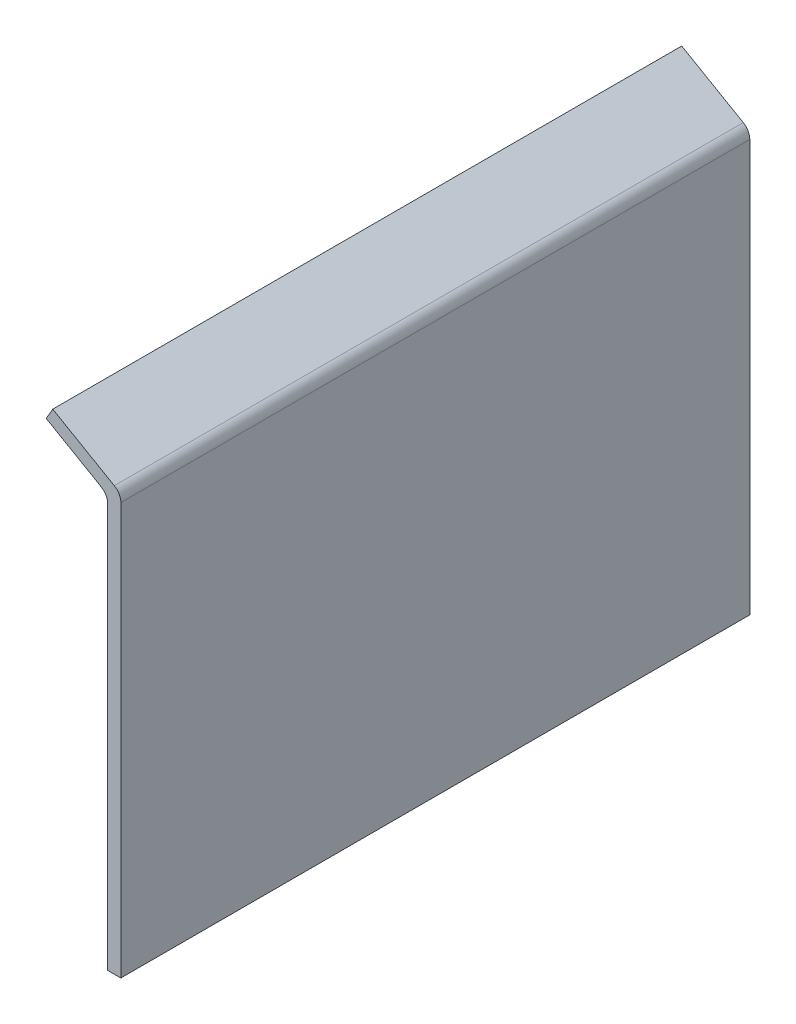
ISO-10303-21;
HEADER;
FILE_DESCRIPTION(('STEP AP214'),'2;1');
FILE_NAME('part.step','',(''),(''),'','','');
FILE_SCHEMA(('AUTOMOTIVE_DESIGN { 1 0 10303 214 1 1 1 1 }'));
ENDSEC;
DATA;
#1=APPLICATION_CONTEXT('core data for automotive mechanical design processes');
#2=APPLICATION_PROTOCOL_DEFINITION('international standard','automotive_design',2000,#1);
#3=PRODUCT_CONTEXT('',#1,'mechanical');
#4=PRODUCT('Part','Part','',(#3));
#5=PRODUCT_RELATED_PRODUCT_CATEGORY('part','',(#4));
#6=PRODUCT_DEFINITION_FORMATION('','',#4);
#7=PRODUCT_DEFINITION_CONTEXT('part definition',#1,'design');
#8=PRODUCT_DEFINITION('design','',#6,#7);
#9=PRODUCT_DEFINITION_SHAPE('','',#8);
#10=(LENGTH_UNIT() NAMED_UNIT(*) SI_UNIT(.MILLI.,.METRE.));
#11=(NAMED_UNIT(*) PLANE_ANGLE_UNIT() SI_UNIT($,.RADIAN.));
#12=(NAMED_UNIT(*) SI_UNIT($,.STERADIAN.) SOLID_ANGLE_UNIT());
#13=UNCERTAINTY_MEASURE_WITH_UNIT(LENGTH_MEASURE(1.E-05),#10,'distance_accuracy_value','');
#14=(GEOMETRIC_REPRESENTATION_CONTEXT(3) GLOBAL_UNCERTAINTY_ASSIGNED_CONTEXT((#13)) GLOBAL_UNIT_ASSIGNED_CONTEXT((#10,
#11,#12)) REPRESENTATION_CONTEXT('',''));
#15=CARTESIAN_POINT('',(0.,0.,0.));
#16=DIRECTION('',(0.,0.,1.));
#17=DIRECTION('',(1.,0.,0.));
#18=AXIS2_PLACEMENT_3D('',#15,#16,#17);
#19=CARTESIAN_POINT('',(6.34999999999998,199.533825790646,0.));
#20=DIRECTION('',(1.,0.,0.));
#21=DIRECTION('',(0.,0.,-1.));
#22=AXIS2_PLACEMENT_3D('',#19,#20,#21);
#23=PLANE('',#22);
#24=DIRECTION('',(0.,1.,0.));
#25=VECTOR('',#24,1.);
#26=CARTESIAN_POINT('',(6.35,0.,0.));
#27=LINE('',#26,#25);
#28=CARTESIAN_POINT('',(6.35,0.,0.));
#29=VERTEX_POINT('',#28);
#30=CARTESIAN_POINT('',(6.34999999999998,199.533825790646,0.));
#31=VERTEX_POINT('',#30);
#32=EDGE_CURVE('E34',#29,#31,#27,.T.);
#33=ORIENTED_EDGE('',*,*,#32,.F.);
#34=DIRECTION('',(0.,0.,-1.));
#35=VECTOR('',#34,1.);
#36=CARTESIAN_POINT('',(6.35,0.,0.));
#37=LINE('',#36,#35);
#38=CARTESIAN_POINT('',(6.35,0.,-304.8));
#39=VERTEX_POINT('',#38);
#40=EDGE_CURVE('E10',#29,#39,#37,.T.);
#41=ORIENTED_EDGE('',*,*,#40,.T.);
#42=DIRECTION('',(0.,-1.,0.));
#43=VECTOR('',#42,1.);
#44=CARTESIAN_POINT('',(6.34999999999998,199.533825790646,-304.8));
#45=LINE('',#44,#43);
#46=CARTESIAN_POINT('',(6.34999999999998,199.533825790646,-304.8));
#47=VERTEX_POINT('',#46);
#48=EDGE_CURVE('E103',#47,#39,#45,.T.);
#49=ORIENTED_EDGE('',*,*,#48,.F.);
#50=DIRECTION('',(0.,0.,-1.));
#51=VECTOR('',#50,1.);
#52=CARTESIAN_POINT('',(6.34999999999998,199.533825790646,0.));
#53=LINE('',#52,#51);
#54=EDGE_CURVE('E26',#31,#47,#53,.T.);
#55=ORIENTED_EDGE('',*,*,#54,.F.);
#56=EDGE_LOOP('',(#33,#41,#49,#55));
#57=FACE_BOUND('',#56,.T.);
#58=ADVANCED_FACE('F16',(#57),#23,.T.);
#59=CARTESIAN_POINT('',(0.,199.533825790646,0.));
#60=DIRECTION('',(0.,0.,-1.));
#61=DIRECTION('',(0.,-1.,0.));
#62=AXIS2_PLACEMENT_3D('',#59,#60,#61);
#63=CYLINDRICAL_SURFACE('',#62,6.35000000000003);
#64=CARTESIAN_POINT('',(0.,199.533825790646,0.));
#65=DIRECTION('',(0.,0.,1.));
#66=DIRECTION('',(1.,0.,0.));
#67=AXIS2_PLACEMENT_3D('',#64,#65,#66);
#68=CIRCLE('',#67,6.35000000000003);
#69=CARTESIAN_POINT('',(3.17499999999997,205.033087104677,0.));
#70=VERTEX_POINT('',#69);
#71=EDGE_CURVE('E109',#31,#70,#68,.T.);
#72=ORIENTED_EDGE('',*,*,#71,.F.);
#73=ORIENTED_EDGE('',*,*,#54,.T.);
#74=CARTESIAN_POINT('',(0.,199.533825790646,-304.8));
#75=DIRECTION('',(0.,0.,-1.));
#76=DIRECTION('',(0.,-1.,0.));
#77=AXIS2_PLACEMENT_3D('',#74,#75,#76);
#78=CIRCLE('',#77,6.35000000000003);
#79=CARTESIAN_POINT('',(3.17499999999997,205.033087104677,-304.8));
#80=VERTEX_POINT('',#79);
#81=EDGE_CURVE('E105',#80,#47,#78,.T.);
#82=ORIENTED_EDGE('',*,*,#81,.F.);
#83=DIRECTION('',(0.,0.,-1.));
#84=VECTOR('',#83,1.);
#85=CARTESIAN_POINT('',(3.17499999999997,205.033087104677,0.));
#86=LINE('',#85,#84);
#87=EDGE_CURVE('E138',#70,#80,#86,.T.);
#88=ORIENTED_EDGE('',*,*,#87,.F.);
#89=EDGE_LOOP('',(#72,#73,#82,#88));
#90=FACE_BOUND('',#89,.T.);
#91=ADVANCED_FACE('F147',(#90),#63,.T.);
#92=CARTESIAN_POINT('',(-26.6455678841872,222.25,0.));
#93=DIRECTION('',(0.499999999999998,0.86602540378444,0.));
#94=DIRECTION('',(-0.86602540378444,0.499999999999998,0.));
#95=AXIS2_PLACEMENT_3D('',#92,#93,#94);
#96=PLANE('',#95);
#97=DIRECTION('',(-0.866025403784439,0.499999999999999,0.));
#98=VECTOR('',#97,1.);
#99=CARTESIAN_POINT('',(3.17499999999994,205.033087104677,0.));
#100=LINE('',#99,#98);
#101=CARTESIAN_POINT('',(-26.6455678841872,222.25,0.));
#102=VERTEX_POINT('',#101);
#103=EDGE_CURVE('E135',#70,#102,#100,.T.);
#104=ORIENTED_EDGE('',*,*,#103,.F.);
#105=ORIENTED_EDGE('',*,*,#87,.T.);
#106=DIRECTION('',(0.866025403784439,-0.5,0.));
#107=VECTOR('',#106,1.);
#108=CARTESIAN_POINT('',(-26.6455678841872,222.25,-304.8));
#109=LINE('',#108,#107);
#110=CARTESIAN_POINT('',(-26.6455678841872,222.25,-304.8));
#111=VERTEX_POINT('',#110);
#112=EDGE_CURVE('E133',#111,#80,#109,.T.);
#113=ORIENTED_EDGE('',*,*,#112,.F.);
#114=DIRECTION('',(0.,0.,-1.));
#115=VECTOR('',#114,1.);
#116=CARTESIAN_POINT('',(-26.6455678841872,222.25,0.));
#117=LINE('',#116,#115);
#118=EDGE_CURVE('E130',#102,#111,#117,.T.);
#119=ORIENTED_EDGE('',*,*,#118,.F.);
#120=EDGE_LOOP('',(#104,#105,#113,#119));
#121=FACE_BOUND('',#120,.T.);
#122=ADVANCED_FACE('F154',(#121),#96,.T.);
#123=CARTESIAN_POINT('',(-29.8205678841872,216.750738685969,0.));
#124=DIRECTION('',(-0.866025403784438,0.500000000000001,0.));
#125=DIRECTION('',(-0.500000000000001,-0.866025403784438,0.));
#126=AXIS2_PLACEMENT_3D('',#123,#124,#125);
#127=PLANE('',#126);
#128=DIRECTION('',(-0.500000000000001,-0.866025403784438,0.));
#129=VECTOR('',#128,1.);
#130=CARTESIAN_POINT('',(-26.6455678841872,222.25,0.));
#131=LINE('',#130,#129);
#132=CARTESIAN_POINT('',(-29.8205678841872,216.750738685969,0.));
#133=VERTEX_POINT('',#132);
#134=EDGE_CURVE('E127',#102,#133,#131,.T.);
#135=ORIENTED_EDGE('',*,*,#134,.F.);
#136=ORIENTED_EDGE('',*,*,#118,.T.);
#137=DIRECTION('',(0.500000000000002,0.866025403784438,0.));
#138=VECTOR('',#137,1.);
#139=CARTESIAN_POINT('',(-29.8205678841872,216.750738685969,-304.8));
#140=LINE('',#139,#138);
#141=CARTESIAN_POINT('',(-29.8205678841872,216.750738685969,-304.8));
#142=VERTEX_POINT('',#141);
#143=EDGE_CURVE('E125',#142,#111,#140,.T.);
#144=ORIENTED_EDGE('',*,*,#143,.F.);
#145=DIRECTION('',(0.,0.,-1.));
#146=VECTOR('',#145,1.);
#147=CARTESIAN_POINT('',(-29.8205678841872,216.750738685969,0.));
#148=LINE('',#147,#146);
#149=EDGE_CURVE('E122',#133,#142,#148,.T.);
#150=ORIENTED_EDGE('',*,*,#149,.F.);
#151=EDGE_LOOP('',(#135,#136,#144,#150));
#152=FACE_BOUND('',#151,.T.);
#153=ADVANCED_FACE('F156',(#152),#127,.T.);
#154=CARTESIAN_POINT('',(-3.1750000000001,201.366912895323,0.));
#155=DIRECTION('',(-0.5,-0.866025403784438,0.));
#156=DIRECTION('',(0.866025403784438,-0.5,0.));
#157=AXIS2_PLACEMENT_3D('',#154,#155,#156);
#158=PLANE('',#157);
#159=DIRECTION('',(0.866025403784438,-0.500000000000002,0.));
#160=VECTOR('',#159,1.);
#161=CARTESIAN_POINT('',(-29.8205678841872,216.750738685969,0.));
#162=LINE('',#161,#160);
#163=CARTESIAN_POINT('',(-3.1750000000001,201.366912895323,0.));
#164=VERTEX_POINT('',#163);
#165=EDGE_CURVE('E119',#133,#164,#162,.T.);
#166=ORIENTED_EDGE('',*,*,#165,.F.);
#167=ORIENTED_EDGE('',*,*,#149,.T.);
#168=DIRECTION('',(-0.866025403784438,0.500000000000001,0.));
#169=VECTOR('',#168,1.);
#170=CARTESIAN_POINT('',(-3.1750000000001,201.366912895323,-304.8));
#171=LINE('',#170,#169);
#172=CARTESIAN_POINT('',(-3.1750000000001,201.366912895323,-304.8));
#173=VERTEX_POINT('',#172);
#174=EDGE_CURVE('E117',#173,#142,#171,.T.);
#175=ORIENTED_EDGE('',*,*,#174,.F.);
#176=DIRECTION('',(0.,0.,-1.));
#177=VECTOR('',#176,1.);
#178=CARTESIAN_POINT('',(-3.1750000000001,201.366912895323,0.));
#179=LINE('',#178,#177);
#180=EDGE_CURVE('E115',#164,#173,#179,.T.);
#181=ORIENTED_EDGE('',*,*,#180,.F.);
#182=EDGE_LOOP('',(#166,#167,#175,#181));
#183=FACE_BOUND('',#182,.T.);
#184=ADVANCED_FACE('F160',(#183),#158,.T.);
#185=CARTESIAN_POINT('',(-6.35000000000005,195.867651581292,0.));
#186=DIRECTION('',(0.,0.,-1.));
#187=DIRECTION('',(0.,-1.,0.));
#188=AXIS2_PLACEMENT_3D('',#185,#186,#187);
#189=CYLINDRICAL_SURFACE('',#188,6.35000000000003);
#190=CARTESIAN_POINT('',(-6.35000000000005,195.867651581292,0.));
#191=DIRECTION('',(0.,0.,-1.));
#192=DIRECTION('',(0.,-1.,0.));
#193=AXIS2_PLACEMENT_3D('',#190,#191,#192);
#194=CIRCLE('',#193,6.35000000000003);
#195=CARTESIAN_POINT('',(0.,195.867651581292,0.));
#196=VERTEX_POINT('',#195);
#197=EDGE_CURVE('E113',#164,#196,#194,.T.);
#198=ORIENTED_EDGE('',*,*,#197,.F.);
#199=ORIENTED_EDGE('',*,*,#180,.T.);
#200=CARTESIAN_POINT('',(-6.35000000000005,195.867651581292,-304.8));
#201=DIRECTION('',(0.,0.,1.));
#202=DIRECTION('',(1.,0.,0.));
#203=AXIS2_PLACEMENT_3D('',#200,#201,#202);
#204=CIRCLE('',#203,6.35000000000003);
#205=CARTESIAN_POINT('',(0.,195.867651581292,-304.8));
#206=VERTEX_POINT('',#205);
#207=EDGE_CURVE('E94',#206,#173,#204,.T.);
#208=ORIENTED_EDGE('',*,*,#207,.F.);
#209=DIRECTION('',(0.,0.,-1.));
#210=VECTOR('',#209,1.);
#211=CARTESIAN_POINT('',(0.,195.867651581292,0.));
#212=LINE('',#211,#210);
#213=EDGE_CURVE('E90',#196,#206,#212,.T.);
#214=ORIENTED_EDGE('',*,*,#213,.F.);
#215=EDGE_LOOP('',(#198,#199,#208,#214));
#216=FACE_BOUND('',#215,.T.);
#217=ADVANCED_FACE('F18',(#216),#189,.F.);
#218=CARTESIAN_POINT('',(0.,0.,0.));
#219=DIRECTION('',(-1.,0.,0.));
#220=DIRECTION('',(0.,0.,1.));
#221=AXIS2_PLACEMENT_3D('',#218,#219,#220);
#222=PLANE('',#221);
#223=DIRECTION('',(0.,-1.,0.));
#224=VECTOR('',#223,1.);
#225=CARTESIAN_POINT('',(0.,195.867651581292,0.));
#226=LINE('',#225,#224);
#227=CARTESIAN_POINT('',(0.,0.,0.));
#228=VERTEX_POINT('',#227);
#229=EDGE_CURVE('E78',#196,#228,#226,.T.);
#230=ORIENTED_EDGE('',*,*,#229,.F.);
#231=ORIENTED_EDGE('',*,*,#213,.T.);
#232=DIRECTION('',(0.,1.,0.));
#233=VECTOR('',#232,1.);
#234=CARTESIAN_POINT('',(0.,0.,-304.8));
#235=LINE('',#234,#233);
#236=CARTESIAN_POINT('',(0.,0.,-304.8));
#237=VERTEX_POINT('',#236);
#238=EDGE_CURVE('E84',#237,#206,#235,.T.);
#239=ORIENTED_EDGE('',*,*,#238,.F.);
#240=DIRECTION('',(0.,0.,-1.));
#241=VECTOR('',#240,1.);
#242=CARTESIAN_POINT('',(0.,0.,0.));
#243=LINE('',#242,#241);
#244=EDGE_CURVE('E87',#228,#237,#243,.T.);
#245=ORIENTED_EDGE('',*,*,#244,.F.);
#246=EDGE_LOOP('',(#230,#231,#239,#245));
#247=FACE_BOUND('',#246,.T.);
#248=ADVANCED_FACE('F86',(#247),#222,.T.);
#249=CARTESIAN_POINT('',(6.35,0.,0.));
#250=DIRECTION('',(0.,-1.,0.));
#251=DIRECTION('',(0.,0.,-1.));
#252=AXIS2_PLACEMENT_3D('',#249,#250,#251);
#253=PLANE('',#252);
#254=DIRECTION('',(1.,0.,0.));
#255=VECTOR('',#254,1.);
#256=CARTESIAN_POINT('',(0.,0.,0.));
#257=LINE('',#256,#255);
#258=EDGE_CURVE('E99',#228,#29,#257,.T.);
#259=ORIENTED_EDGE('',*,*,#258,.F.);
#260=ORIENTED_EDGE('',*,*,#244,.T.);
#261=DIRECTION('',(-1.,0.,0.));
#262=VECTOR('',#261,1.);
#263=CARTESIAN_POINT('',(6.35,0.,-304.8));
#264=LINE('',#263,#262);
#265=EDGE_CURVE('E20',#39,#237,#264,.T.);
#266=ORIENTED_EDGE('',*,*,#265,.F.);
#267=ORIENTED_EDGE('',*,*,#40,.F.);
#268=EDGE_LOOP('',(#259,#260,#266,#267));
#269=FACE_BOUND('',#268,.T.);
#270=ADVANCED_FACE('F98',(#269),#253,.T.);
#271=CARTESIAN_POINT('',(0.448900514581326,116.44186250355,-304.8));
#272=DIRECTION('',(0.,0.,1.));
#273=DIRECTION('',(1.,0.,0.));
#274=AXIS2_PLACEMENT_3D('',#271,#272,#273);
#275=PLANE('',#274);
#276=ORIENTED_EDGE('',*,*,#265,.T.);
#277=ORIENTED_EDGE('',*,*,#238,.T.);
#278=ORIENTED_EDGE('',*,*,#207,.T.);
#279=ORIENTED_EDGE('',*,*,#174,.T.);
#280=ORIENTED_EDGE('',*,*,#143,.T.);
#281=ORIENTED_EDGE('',*,*,#112,.T.);
#282=ORIENTED_EDGE('',*,*,#81,.T.);
#283=ORIENTED_EDGE('',*,*,#48,.T.);
#284=EDGE_LOOP('',(#276,#277,#278,#279,#280,#281,#282,#283));
#285=FACE_BOUND('',#284,.T.);
#286=ADVANCED_FACE('F101',(#285),#275,.F.);
#287=CARTESIAN_POINT('',(0.448900514581326,116.44186250355,0.));
#288=DIRECTION('',(0.,0.,1.));
#289=DIRECTION('',(1.,0.,0.));
#290=AXIS2_PLACEMENT_3D('',#287,#288,#289);
#291=PLANE('',#290);
#292=ORIENTED_EDGE('',*,*,#258,.T.);
#293=ORIENTED_EDGE('',*,*,#32,.T.);
#294=ORIENTED_EDGE('',*,*,#71,.T.);
#295=ORIENTED_EDGE('',*,*,#103,.T.);
#296=ORIENTED_EDGE('',*,*,#134,.T.);
#297=ORIENTED_EDGE('',*,*,#165,.T.);
#298=ORIENTED_EDGE('',*,*,#197,.T.);
#299=ORIENTED_EDGE('',*,*,#229,.T.);
#300=EDGE_LOOP('',(#292,#293,#294,#295,#296,#297,#298,#299));
#301=FACE_BOUND('',#300,.T.);
#302=ADVANCED_FACE('F108',(#301),#291,.T.);
#303=CLOSED_SHELL('',(#58,#91,#122,#153,#184,#217,#248,#270,#286,#302));
#304=MANIFOLD_SOLID_BREP('B1',#303);
#305=ADVANCED_BREP_SHAPE_REPRESENTATION('',(#18,#304),#14);
#306=SHAPE_DEFINITION_REPRESENTATION(#9,#305);
ENDSEC;
END-ISO-10303-21;
